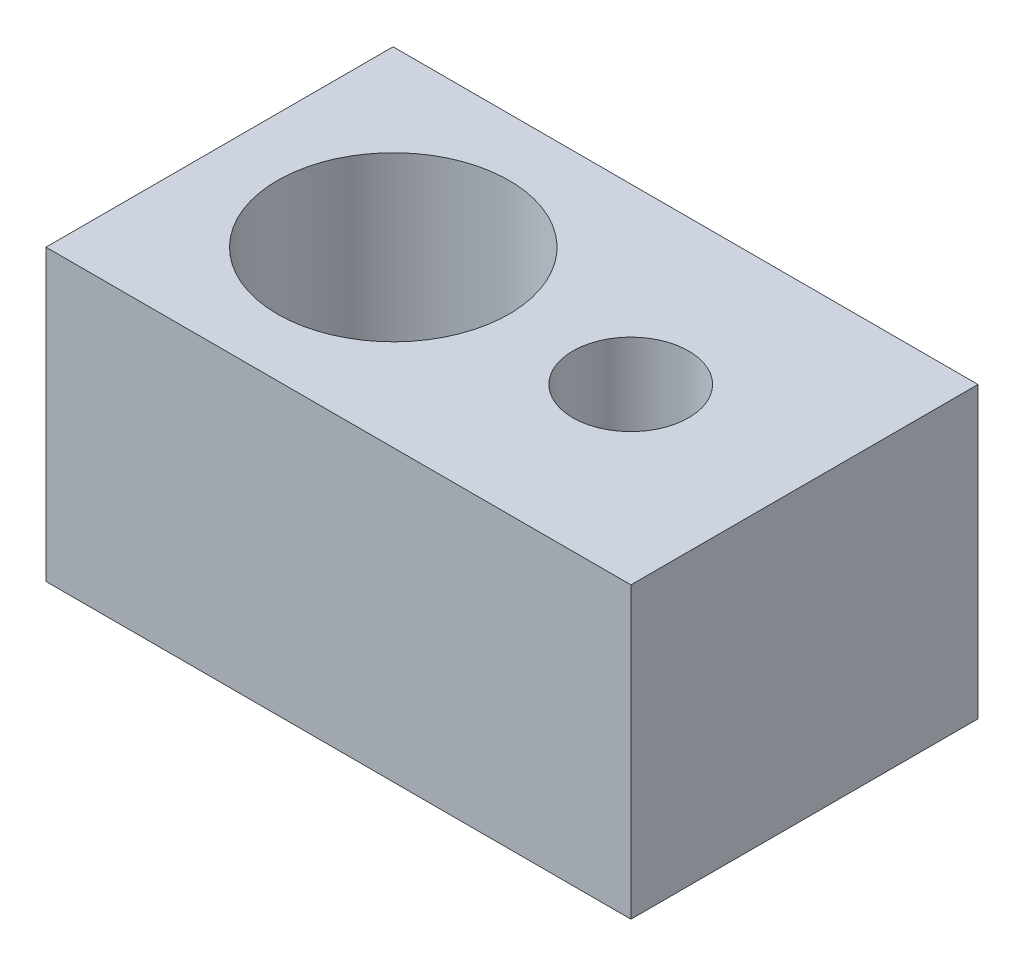
ISO-10303-21;
HEADER;
FILE_DESCRIPTION(('STEP AP214'),'2;1');
FILE_NAME('part.step','',(''),(''),'','','');
FILE_SCHEMA(('AUTOMOTIVE_DESIGN { 1 0 10303 214 1 1 1 1 }'));
ENDSEC;
DATA;
#1=APPLICATION_CONTEXT('core data for automotive mechanical design processes');
#2=APPLICATION_PROTOCOL_DEFINITION('international standard','automotive_design',2000,#1);
#3=PRODUCT_CONTEXT('',#1,'mechanical');
#4=PRODUCT('Part','Part','',(#3));
#5=PRODUCT_RELATED_PRODUCT_CATEGORY('part','',(#4));
#6=PRODUCT_DEFINITION_FORMATION('','',#4);
#7=PRODUCT_DEFINITION_CONTEXT('part definition',#1,'design');
#8=PRODUCT_DEFINITION('design','',#6,#7);
#9=PRODUCT_DEFINITION_SHAPE('','',#8);
#10=(LENGTH_UNIT() NAMED_UNIT(*) SI_UNIT(.MILLI.,.METRE.));
#11=(NAMED_UNIT(*) PLANE_ANGLE_UNIT() SI_UNIT($,.RADIAN.));
#12=(NAMED_UNIT(*) SI_UNIT($,.STERADIAN.) SOLID_ANGLE_UNIT());
#13=UNCERTAINTY_MEASURE_WITH_UNIT(LENGTH_MEASURE(1.E-05),#10,'distance_accuracy_value','');
#14=(GEOMETRIC_REPRESENTATION_CONTEXT(3) GLOBAL_UNCERTAINTY_ASSIGNED_CONTEXT((#13)) GLOBAL_UNIT_ASSIGNED_CONTEXT((#10,
#11,#12)) REPRESENTATION_CONTEXT('',''));
#15=CARTESIAN_POINT('',(0.,0.,0.));
#16=DIRECTION('',(0.,0.,1.));
#17=DIRECTION('',(1.,0.,0.));
#18=AXIS2_PLACEMENT_3D('',#15,#16,#17);
#19=CARTESIAN_POINT('',(-20.5,50.,0.));
#20=DIRECTION('',(0.,-1.,0.));
#21=DIRECTION('',(0.,0.,-1.));
#22=AXIS2_PLACEMENT_3D('',#19,#20,#21);
#23=CYLINDRICAL_SURFACE('',#22,11.);
#24=CARTESIAN_POINT('',(-20.5,10.,0.));
#25=DIRECTION('',(0.,-1.,0.));
#26=DIRECTION('',(0.,0.,-1.));
#27=AXIS2_PLACEMENT_3D('',#24,#25,#26);
#28=CIRCLE('',#27,11.);
#29=CARTESIAN_POINT('',(-20.5,10.,-11.));
#30=VERTEX_POINT('',#29);
#31=EDGE_CURVE('E111',#30,#30,#28,.T.);
#32=ORIENTED_EDGE('',*,*,#31,.T.);
#33=EDGE_LOOP('',(#32));
#34=FACE_BOUND('',#33,.T.);
#35=CARTESIAN_POINT('',(-20.5,11.,0.));
#36=DIRECTION('',(0.,1.,0.));
#37=DIRECTION('',(0.,0.,1.));
#38=AXIS2_PLACEMENT_3D('',#35,#36,#37);
#39=CIRCLE('',#38,11.);
#40=CARTESIAN_POINT('',(-20.5,11.,11.));
#41=VERTEX_POINT('',#40);
#42=EDGE_CURVE('E40',#41,#41,#39,.T.);
#43=ORIENTED_EDGE('',*,*,#42,.T.);
#44=EDGE_LOOP('',(#43));
#45=FACE_BOUND('',#44,.T.);
#46=ADVANCED_FACE('F36',(#34,#45),#23,.F.);
#47=CARTESIAN_POINT('',(50.5,50.,0.));
#48=DIRECTION('',(1.,0.,0.));
#49=DIRECTION('',(0.,0.,-1.));
#50=AXIS2_PLACEMENT_3D('',#47,#48,#49);
#51=PLANE('',#50);
#52=DIRECTION('',(0.,0.,1.));
#53=VECTOR('',#52,1.);
#54=CARTESIAN_POINT('',(50.5,0.,0.));
#55=LINE('',#54,#53);
#56=CARTESIAN_POINT('',(50.5,0.,-29.9660239638685));
#57=VERTEX_POINT('',#56);
#58=CARTESIAN_POINT('',(50.5,0.,29.9660239638685));
#59=VERTEX_POINT('',#58);
#60=EDGE_CURVE('E110',#57,#59,#55,.T.);
#61=ORIENTED_EDGE('',*,*,#60,.F.);
#62=DIRECTION('',(0.,-1.,0.));
#63=VECTOR('',#62,1.);
#64=CARTESIAN_POINT('',(50.5,50.,-29.9660239638685));
#65=LINE('',#64,#63);
#66=CARTESIAN_POINT('',(50.5,50.,-29.9660239638685));
#67=VERTEX_POINT('',#66);
#68=EDGE_CURVE('E11',#67,#57,#65,.T.);
#69=ORIENTED_EDGE('',*,*,#68,.F.);
#70=DIRECTION('',(0.,0.,1.));
#71=VECTOR('',#70,1.);
#72=CARTESIAN_POINT('',(50.5,50.,0.));
#73=LINE('',#72,#71);
#74=CARTESIAN_POINT('',(50.5,50.,29.9660239638685));
#75=VERTEX_POINT('',#74);
#76=EDGE_CURVE('E100',#67,#75,#73,.T.);
#77=ORIENTED_EDGE('',*,*,#76,.T.);
#78=DIRECTION('',(0.,-1.,0.));
#79=VECTOR('',#78,1.);
#80=CARTESIAN_POINT('',(50.5,50.,29.9660239638685));
#81=LINE('',#80,#79);
#82=EDGE_CURVE('E78',#75,#59,#81,.T.);
#83=ORIENTED_EDGE('',*,*,#82,.T.);
#84=EDGE_LOOP('',(#61,#69,#77,#83));
#85=FACE_BOUND('',#84,.T.);
#86=ADVANCED_FACE('F155',(#85),#51,.T.);
#87=CARTESIAN_POINT('',(0.,50.,-29.9660239638685));
#88=DIRECTION('',(0.,0.,-1.));
#89=DIRECTION('',(-1.,0.,0.));
#90=AXIS2_PLACEMENT_3D('',#87,#88,#89);
#91=PLANE('',#90);
#92=DIRECTION('',(1.,0.,0.));
#93=VECTOR('',#92,1.);
#94=CARTESIAN_POINT('',(0.,0.,-29.9660239638685));
#95=LINE('',#94,#93);
#96=CARTESIAN_POINT('',(-50.5,0.,-29.9660239638685));
#97=VERTEX_POINT('',#96);
#98=EDGE_CURVE('E90',#97,#57,#95,.T.);
#99=ORIENTED_EDGE('',*,*,#98,.F.);
#100=DIRECTION('',(0.,-1.,0.));
#101=VECTOR('',#100,1.);
#102=CARTESIAN_POINT('',(-50.5,50.,-29.9660239638685));
#103=LINE('',#102,#101);
#104=CARTESIAN_POINT('',(-50.5,50.,-29.9660239638685));
#105=VERTEX_POINT('',#104);
#106=EDGE_CURVE('E46',#105,#97,#103,.T.);
#107=ORIENTED_EDGE('',*,*,#106,.F.);
#108=DIRECTION('',(1.,0.,0.));
#109=VECTOR('',#108,1.);
#110=CARTESIAN_POINT('',(0.,50.,-29.9660239638685));
#111=LINE('',#110,#109);
#112=EDGE_CURVE('E88',#105,#67,#111,.T.);
#113=ORIENTED_EDGE('',*,*,#112,.T.);
#114=ORIENTED_EDGE('',*,*,#68,.T.);
#115=EDGE_LOOP('',(#99,#107,#113,#114));
#116=FACE_BOUND('',#115,.T.);
#117=ADVANCED_FACE('F86',(#116),#91,.T.);
#118=CARTESIAN_POINT('',(-50.5,50.,0.));
#119=DIRECTION('',(1.,0.,0.));
#120=DIRECTION('',(0.,0.,-1.));
#121=AXIS2_PLACEMENT_3D('',#118,#119,#120);
#122=PLANE('',#121);
#123=DIRECTION('',(0.,0.,1.));
#124=VECTOR('',#123,1.);
#125=CARTESIAN_POINT('',(-50.5,0.,0.));
#126=LINE('',#125,#124);
#127=CARTESIAN_POINT('',(-50.5,0.,29.9660239638685));
#128=VERTEX_POINT('',#127);
#129=EDGE_CURVE('E114',#97,#128,#126,.T.);
#130=ORIENTED_EDGE('',*,*,#129,.T.);
#131=DIRECTION('',(0.,-1.,0.));
#132=VECTOR('',#131,1.);
#133=CARTESIAN_POINT('',(-50.5,50.,29.9660239638685));
#134=LINE('',#133,#132);
#135=CARTESIAN_POINT('',(-50.5,50.,29.9660239638685));
#136=VERTEX_POINT('',#135);
#137=EDGE_CURVE('E93',#136,#128,#134,.T.);
#138=ORIENTED_EDGE('',*,*,#137,.F.);
#139=DIRECTION('',(0.,0.,1.));
#140=VECTOR('',#139,1.);
#141=CARTESIAN_POINT('',(-50.5,50.,0.));
#142=LINE('',#141,#140);
#143=EDGE_CURVE('E96',#105,#136,#142,.T.);
#144=ORIENTED_EDGE('',*,*,#143,.F.);
#145=ORIENTED_EDGE('',*,*,#106,.T.);
#146=EDGE_LOOP('',(#130,#138,#144,#145));
#147=FACE_BOUND('',#146,.T.);
#148=ADVANCED_FACE('F97',(#147),#122,.F.);
#149=CARTESIAN_POINT('',(20.5,50.,0.));
#150=DIRECTION('',(0.,-1.,0.));
#151=DIRECTION('',(0.,0.,-1.));
#152=AXIS2_PLACEMENT_3D('',#149,#150,#151);
#153=CYLINDRICAL_SURFACE('',#152,10.);
#154=CARTESIAN_POINT('',(20.5,50.,0.));
#155=DIRECTION('',(0.,1.,0.));
#156=DIRECTION('',(0.,0.,1.));
#157=AXIS2_PLACEMENT_3D('',#154,#155,#156);
#158=CIRCLE('',#157,10.);
#159=CARTESIAN_POINT('',(20.5,50.,10.));
#160=VERTEX_POINT('',#159);
#161=EDGE_CURVE('E102',#160,#160,#158,.T.);
#162=ORIENTED_EDGE('',*,*,#161,.T.);
#163=EDGE_LOOP('',(#162));
#164=FACE_BOUND('',#163,.T.);
#165=CARTESIAN_POINT('',(20.5,0.,0.));
#166=DIRECTION('',(0.,1.,0.));
#167=DIRECTION('',(0.,0.,1.));
#168=AXIS2_PLACEMENT_3D('',#165,#166,#167);
#169=CIRCLE('',#168,10.);
#170=CARTESIAN_POINT('',(20.5,0.,10.));
#171=VERTEX_POINT('',#170);
#172=EDGE_CURVE('E107',#171,#171,#169,.T.);
#173=ORIENTED_EDGE('',*,*,#172,.F.);
#174=EDGE_LOOP('',(#173));
#175=FACE_BOUND('',#174,.T.);
#176=ADVANCED_FACE('F38',(#164,#175),#153,.F.);
#177=CARTESIAN_POINT('',(0.,50.,29.9660239638685));
#178=DIRECTION('',(0.,0.,-1.));
#179=DIRECTION('',(-1.,0.,0.));
#180=AXIS2_PLACEMENT_3D('',#177,#178,#179);
#181=PLANE('',#180);
#182=DIRECTION('',(1.,0.,0.));
#183=VECTOR('',#182,1.);
#184=CARTESIAN_POINT('',(0.,0.,29.9660239638685));
#185=LINE('',#184,#183);
#186=EDGE_CURVE('E71',#128,#59,#185,.T.);
#187=ORIENTED_EDGE('',*,*,#186,.T.);
#188=ORIENTED_EDGE('',*,*,#82,.F.);
#189=DIRECTION('',(1.,0.,0.));
#190=VECTOR('',#189,1.);
#191=CARTESIAN_POINT('',(0.,50.,29.9660239638685));
#192=LINE('',#191,#190);
#193=EDGE_CURVE('E55',#136,#75,#192,.T.);
#194=ORIENTED_EDGE('',*,*,#193,.F.);
#195=ORIENTED_EDGE('',*,*,#137,.T.);
#196=EDGE_LOOP('',(#187,#188,#194,#195));
#197=FACE_BOUND('',#196,.T.);
#198=ADVANCED_FACE('F139',(#197),#181,.F.);
#199=CARTESIAN_POINT('',(0.,50.,0.));
#200=DIRECTION('',(0.,1.,0.));
#201=DIRECTION('',(0.,0.,1.));
#202=AXIS2_PLACEMENT_3D('',#199,#200,#201);
#203=PLANE('',#202);
#204=CARTESIAN_POINT('',(-20.5,50.,0.));
#205=DIRECTION('',(0.,1.,0.));
#206=DIRECTION('',(0.,0.,1.));
#207=AXIS2_PLACEMENT_3D('',#204,#205,#206);
#208=CIRCLE('',#207,20.);
#209=CARTESIAN_POINT('',(-20.5,50.,20.));
#210=VERTEX_POINT('',#209);
#211=EDGE_CURVE('E130',#210,#210,#208,.T.);
#212=ORIENTED_EDGE('',*,*,#211,.F.);
#213=EDGE_LOOP('',(#212));
#214=FACE_BOUND('',#213,.T.);
#215=ORIENTED_EDGE('',*,*,#161,.F.);
#216=EDGE_LOOP('',(#215));
#217=FACE_BOUND('',#216,.T.);
#218=ORIENTED_EDGE('',*,*,#76,.F.);
#219=ORIENTED_EDGE('',*,*,#112,.F.);
#220=ORIENTED_EDGE('',*,*,#143,.T.);
#221=ORIENTED_EDGE('',*,*,#193,.T.);
#222=EDGE_LOOP('',(#218,#219,#220,#221));
#223=FACE_BOUND('',#222,.T.);
#224=ADVANCED_FACE('F99',(#214,#217,#223),#203,.T.);
#225=CARTESIAN_POINT('',(0.,0.,0.));
#226=DIRECTION('',(0.,1.,0.));
#227=DIRECTION('',(0.,0.,1.));
#228=AXIS2_PLACEMENT_3D('',#225,#226,#227);
#229=PLANE('',#228);
#230=CARTESIAN_POINT('',(-20.5,0.,0.));
#231=DIRECTION('',(0.,-1.,0.));
#232=DIRECTION('',(0.,0.,-1.));
#233=AXIS2_PLACEMENT_3D('',#230,#231,#232);
#234=CIRCLE('',#233,17.);
#235=CARTESIAN_POINT('',(-20.5,0.,-17.));
#236=VERTEX_POINT('',#235);
#237=EDGE_CURVE('E123',#236,#236,#234,.T.);
#238=ORIENTED_EDGE('',*,*,#237,.F.);
#239=EDGE_LOOP('',(#238));
#240=FACE_BOUND('',#239,.T.);
#241=ORIENTED_EDGE('',*,*,#172,.T.);
#242=EDGE_LOOP('',(#241));
#243=FACE_BOUND('',#242,.T.);
#244=ORIENTED_EDGE('',*,*,#60,.T.);
#245=ORIENTED_EDGE('',*,*,#186,.F.);
#246=ORIENTED_EDGE('',*,*,#129,.F.);
#247=ORIENTED_EDGE('',*,*,#98,.T.);
#248=EDGE_LOOP('',(#244,#245,#246,#247));
#249=FACE_BOUND('',#248,.T.);
#250=ADVANCED_FACE('F138',(#240,#243,#249),#229,.F.);
#251=CARTESIAN_POINT('',(-20.5,10.,0.));
#252=DIRECTION('',(0.,-1.,0.));
#253=DIRECTION('',(0.,0.,-1.));
#254=AXIS2_PLACEMENT_3D('',#251,#252,#253);
#255=CYLINDRICAL_SURFACE('',#254,17.);
#256=CARTESIAN_POINT('',(-20.5,10.,0.));
#257=DIRECTION('',(0.,-1.,0.));
#258=DIRECTION('',(0.,0.,-1.));
#259=AXIS2_PLACEMENT_3D('',#256,#257,#258);
#260=CIRCLE('',#259,17.);
#261=CARTESIAN_POINT('',(-20.5,10.,-17.));
#262=VERTEX_POINT('',#261);
#263=EDGE_CURVE('E119',#262,#262,#260,.T.);
#264=ORIENTED_EDGE('',*,*,#263,.F.);
#265=EDGE_LOOP('',(#264));
#266=FACE_BOUND('',#265,.T.);
#267=ORIENTED_EDGE('',*,*,#237,.T.);
#268=EDGE_LOOP('',(#267));
#269=FACE_BOUND('',#268,.T.);
#270=ADVANCED_FACE('F147',(#266,#269),#255,.F.);
#271=CARTESIAN_POINT('',(-20.5,10.,0.));
#272=DIRECTION('',(0.,-1.,0.));
#273=DIRECTION('',(0.,0.,-1.));
#274=AXIS2_PLACEMENT_3D('',#271,#272,#273);
#275=PLANE('',#274);
#276=ORIENTED_EDGE('',*,*,#31,.F.);
#277=EDGE_LOOP('',(#276));
#278=FACE_BOUND('',#277,.T.);
#279=ORIENTED_EDGE('',*,*,#263,.T.);
#280=EDGE_LOOP('',(#279));
#281=FACE_BOUND('',#280,.T.);
#282=ADVANCED_FACE('F192',(#278,#281),#275,.T.);
#283=CARTESIAN_POINT('',(-20.5,11.,0.));
#284=DIRECTION('',(0.,1.,0.));
#285=DIRECTION('',(0.,0.,1.));
#286=AXIS2_PLACEMENT_3D('',#283,#284,#285);
#287=CYLINDRICAL_SURFACE('',#286,20.);
#288=CARTESIAN_POINT('',(-20.5,11.,0.));
#289=DIRECTION('',(0.,1.,0.));
#290=DIRECTION('',(0.,0.,1.));
#291=AXIS2_PLACEMENT_3D('',#288,#289,#290);
#292=CIRCLE('',#291,20.);
#293=CARTESIAN_POINT('',(-20.5,11.,20.));
#294=VERTEX_POINT('',#293);
#295=EDGE_CURVE('E228',#294,#294,#292,.T.);
#296=ORIENTED_EDGE('',*,*,#295,.F.);
#297=EDGE_LOOP('',(#296));
#298=FACE_BOUND('',#297,.T.);
#299=ORIENTED_EDGE('',*,*,#211,.T.);
#300=EDGE_LOOP('',(#299));
#301=FACE_BOUND('',#300,.T.);
#302=ADVANCED_FACE('F196',(#298,#301),#287,.F.);
#303=CARTESIAN_POINT('',(-20.5,11.,0.));
#304=DIRECTION('',(0.,1.,0.));
#305=DIRECTION('',(0.,0.,1.));
#306=AXIS2_PLACEMENT_3D('',#303,#304,#305);
#307=PLANE('',#306);
#308=ORIENTED_EDGE('',*,*,#42,.F.);
#309=EDGE_LOOP('',(#308));
#310=FACE_BOUND('',#309,.T.);
#311=ORIENTED_EDGE('',*,*,#295,.T.);
#312=EDGE_LOOP('',(#311));
#313=FACE_BOUND('',#312,.T.);
#314=ADVANCED_FACE('F209',(#310,#313),#307,.T.);
#315=CLOSED_SHELL('',(#46,#86,#117,#148,#176,#198,#224,#250,#270,#282,#302,#314));
#316=MANIFOLD_SOLID_BREP('B2',#315);
#317=ADVANCED_BREP_SHAPE_REPRESENTATION('',(#18,#316),#14);
#318=SHAPE_DEFINITION_REPRESENTATION(#9,#317);
ENDSEC;
END-ISO-10303-21;
